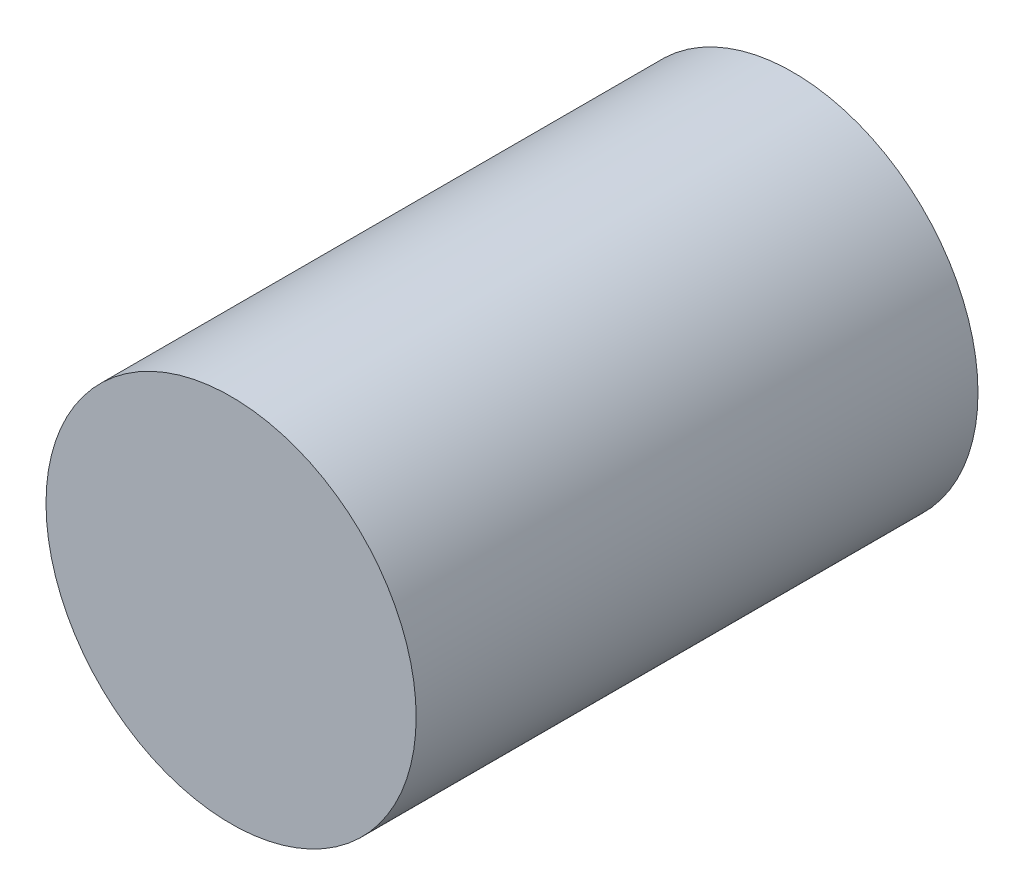
ISO-10303-21;
HEADER;
FILE_DESCRIPTION(('STEP AP214'),'2;1');
FILE_NAME('part.step','',(''),(''),'','','');
FILE_SCHEMA(('AUTOMOTIVE_DESIGN { 1 0 10303 214 1 1 1 1 }'));
ENDSEC;
DATA;
#1=APPLICATION_CONTEXT('core data for automotive mechanical design processes');
#2=APPLICATION_PROTOCOL_DEFINITION('international standard','automotive_design',2000,#1);
#3=PRODUCT_CONTEXT('',#1,'mechanical');
#4=PRODUCT('Part','Part','',(#3));
#5=PRODUCT_RELATED_PRODUCT_CATEGORY('part','',(#4));
#6=PRODUCT_DEFINITION_FORMATION('','',#4);
#7=PRODUCT_DEFINITION_CONTEXT('part definition',#1,'design');
#8=PRODUCT_DEFINITION('design','',#6,#7);
#9=PRODUCT_DEFINITION_SHAPE('','',#8);
#10=(LENGTH_UNIT() NAMED_UNIT(*) SI_UNIT(.MILLI.,.METRE.));
#11=(NAMED_UNIT(*) PLANE_ANGLE_UNIT() SI_UNIT($,.RADIAN.));
#12=(NAMED_UNIT(*) SI_UNIT($,.STERADIAN.) SOLID_ANGLE_UNIT());
#13=UNCERTAINTY_MEASURE_WITH_UNIT(LENGTH_MEASURE(1.E-05),#10,'distance_accuracy_value','');
#14=(GEOMETRIC_REPRESENTATION_CONTEXT(3) GLOBAL_UNCERTAINTY_ASSIGNED_CONTEXT((#13)) GLOBAL_UNIT_ASSIGNED_CONTEXT((#10,
#11,#12)) REPRESENTATION_CONTEXT('',''));
#15=CARTESIAN_POINT('',(0.,0.,0.));
#16=DIRECTION('',(0.,0.,1.));
#17=DIRECTION('',(1.,0.,0.));
#18=AXIS2_PLACEMENT_3D('',#15,#16,#17);
#19=CARTESIAN_POINT('',(0.,0.,85.));
#20=DIRECTION('',(0.,0.,-1.));
#21=DIRECTION('',(-1.,0.,0.));
#22=AXIS2_PLACEMENT_3D('',#19,#20,#21);
#23=CYLINDRICAL_SURFACE('',#22,28.);
#24=CARTESIAN_POINT('',(0.,0.,85.));
#25=DIRECTION('',(0.,0.,1.));
#26=DIRECTION('',(1.,0.,0.));
#27=AXIS2_PLACEMENT_3D('',#24,#25,#26);
#28=CIRCLE('',#27,28.);
#29=CARTESIAN_POINT('',(28.,0.,85.));
#30=VERTEX_POINT('',#29);
#31=EDGE_CURVE('E10',#30,#30,#28,.T.);
#32=ORIENTED_EDGE('',*,*,#31,.F.);
#33=EDGE_LOOP('',(#32));
#34=FACE_BOUND('',#33,.T.);
#35=CARTESIAN_POINT('',(0.,0.,0.));
#36=DIRECTION('',(0.,0.,1.));
#37=DIRECTION('',(1.,0.,0.));
#38=AXIS2_PLACEMENT_3D('',#35,#36,#37);
#39=CIRCLE('',#38,28.);
#40=CARTESIAN_POINT('',(28.,0.,0.));
#41=VERTEX_POINT('',#40);
#42=EDGE_CURVE('E42',#41,#41,#39,.T.);
#43=ORIENTED_EDGE('',*,*,#42,.T.);
#44=EDGE_LOOP('',(#43));
#45=FACE_BOUND('',#44,.T.);
#46=ADVANCED_FACE('F39',(#34,#45),#23,.T.);
#47=CARTESIAN_POINT('',(0.,0.,85.));
#48=DIRECTION('',(0.,0.,1.));
#49=DIRECTION('',(1.,0.,0.));
#50=AXIS2_PLACEMENT_3D('',#47,#48,#49);
#51=PLANE('',#50);
#52=ORIENTED_EDGE('',*,*,#31,.T.);
#53=EDGE_LOOP('',(#52));
#54=FACE_BOUND('',#53,.T.);
#55=ADVANCED_FACE('F54',(#54),#51,.T.);
#56=CARTESIAN_POINT('',(0.,0.,0.));
#57=DIRECTION('',(0.,0.,1.));
#58=DIRECTION('',(1.,0.,0.));
#59=AXIS2_PLACEMENT_3D('',#56,#57,#58);
#60=PLANE('',#59);
#61=ORIENTED_EDGE('',*,*,#42,.F.);
#62=EDGE_LOOP('',(#61));
#63=FACE_BOUND('',#62,.T.);
#64=ADVANCED_FACE('F52',(#63),#60,.F.);
#65=CLOSED_SHELL('',(#46,#55,#64));
#66=MANIFOLD_SOLID_BREP('B2',#65);
#67=ADVANCED_BREP_SHAPE_REPRESENTATION('',(#18,#66),#14);
#68=SHAPE_DEFINITION_REPRESENTATION(#9,#67);
ENDSEC;
END-ISO-10303-21;
